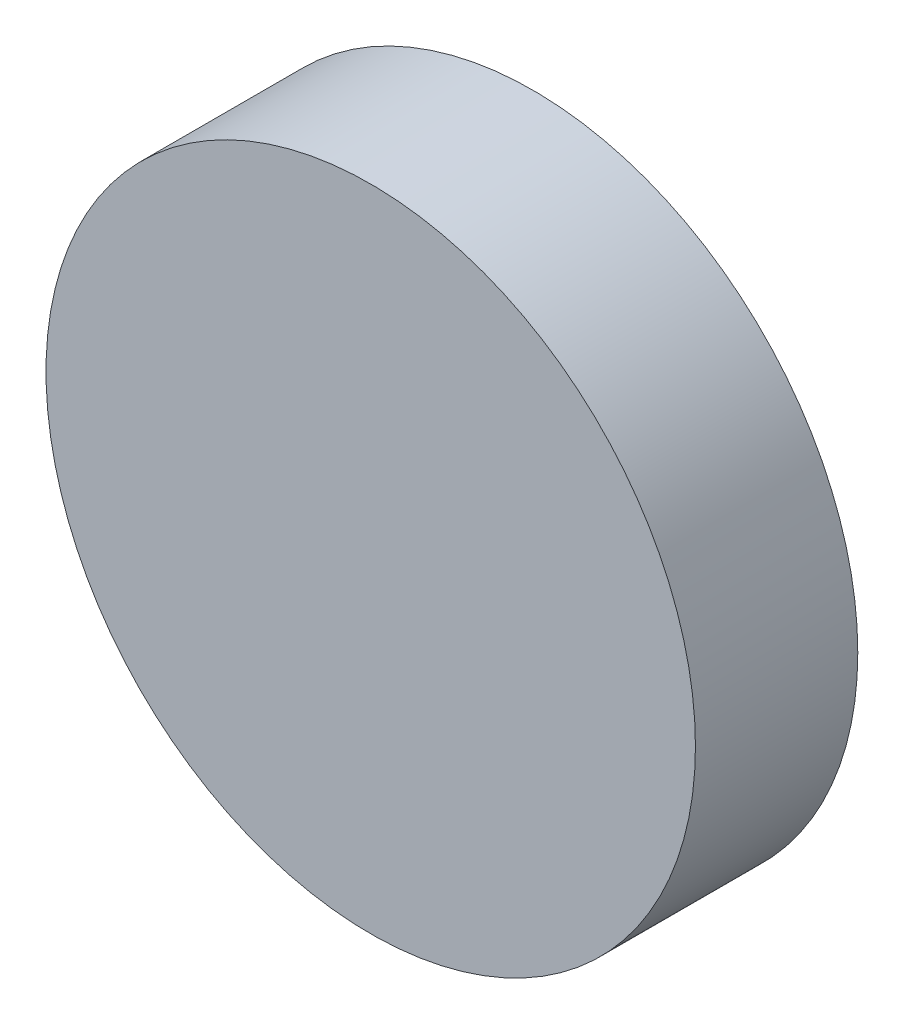
ISO-10303-21;
HEADER;
FILE_DESCRIPTION(('STEP AP214'),'2;1');
FILE_NAME('part.step','',(''),(''),'','','');
FILE_SCHEMA(('AUTOMOTIVE_DESIGN { 1 0 10303 214 1 1 1 1 }'));
ENDSEC;
DATA;
#1=APPLICATION_CONTEXT('core data for automotive mechanical design processes');
#2=APPLICATION_PROTOCOL_DEFINITION('international standard','automotive_design',2000,#1);
#3=PRODUCT_CONTEXT('',#1,'mechanical');
#4=PRODUCT('Part','Part','',(#3));
#5=PRODUCT_RELATED_PRODUCT_CATEGORY('part','',(#4));
#6=PRODUCT_DEFINITION_FORMATION('','',#4);
#7=PRODUCT_DEFINITION_CONTEXT('part definition',#1,'design');
#8=PRODUCT_DEFINITION('design','',#6,#7);
#9=PRODUCT_DEFINITION_SHAPE('','',#8);
#10=(LENGTH_UNIT() NAMED_UNIT(*) SI_UNIT(.MILLI.,.METRE.));
#11=(NAMED_UNIT(*) PLANE_ANGLE_UNIT() SI_UNIT($,.RADIAN.));
#12=(NAMED_UNIT(*) SI_UNIT($,.STERADIAN.) SOLID_ANGLE_UNIT());
#13=UNCERTAINTY_MEASURE_WITH_UNIT(LENGTH_MEASURE(1.E-05),#10,'distance_accuracy_value','');
#14=(GEOMETRIC_REPRESENTATION_CONTEXT(3) GLOBAL_UNCERTAINTY_ASSIGNED_CONTEXT((#13)) GLOBAL_UNIT_ASSIGNED_CONTEXT((#10,
#11,#12)) REPRESENTATION_CONTEXT('',''));
#15=CARTESIAN_POINT('',(0.,0.,0.));
#16=DIRECTION('',(0.,0.,1.));
#17=DIRECTION('',(1.,0.,0.));
#18=AXIS2_PLACEMENT_3D('',#15,#16,#17);
#19=CARTESIAN_POINT('',(0.,0.,12.7));
#20=DIRECTION('',(0.,0.,-1.));
#21=DIRECTION('',(-1.,0.,0.));
#22=AXIS2_PLACEMENT_3D('',#19,#20,#21);
#23=CYLINDRICAL_SURFACE('',#22,25.4);
#24=CARTESIAN_POINT('',(0.,0.,12.7));
#25=DIRECTION('',(0.,0.,1.));
#26=DIRECTION('',(1.,0.,0.));
#27=AXIS2_PLACEMENT_3D('',#24,#25,#26);
#28=CIRCLE('',#27,25.4);
#29=CARTESIAN_POINT('',(25.4,0.,12.7));
#30=VERTEX_POINT('',#29);
#31=EDGE_CURVE('E10',#30,#30,#28,.T.);
#32=ORIENTED_EDGE('',*,*,#31,.F.);
#33=EDGE_LOOP('',(#32));
#34=FACE_BOUND('',#33,.T.);
#35=CARTESIAN_POINT('',(0.,0.,0.));
#36=DIRECTION('',(0.,0.,1.));
#37=DIRECTION('',(1.,0.,0.));
#38=AXIS2_PLACEMENT_3D('',#35,#36,#37);
#39=CIRCLE('',#38,25.4);
#40=CARTESIAN_POINT('',(25.4,0.,0.));
#41=VERTEX_POINT('',#40);
#42=EDGE_CURVE('E40',#41,#41,#39,.T.);
#43=ORIENTED_EDGE('',*,*,#42,.T.);
#44=EDGE_LOOP('',(#43));
#45=FACE_BOUND('',#44,.T.);
#46=ADVANCED_FACE('F37',(#34,#45),#23,.T.);
#47=CARTESIAN_POINT('',(0.,0.,12.7));
#48=DIRECTION('',(0.,0.,1.));
#49=DIRECTION('',(1.,0.,0.));
#50=AXIS2_PLACEMENT_3D('',#47,#48,#49);
#51=PLANE('',#50);
#52=ORIENTED_EDGE('',*,*,#31,.T.);
#53=EDGE_LOOP('',(#52));
#54=FACE_BOUND('',#53,.T.);
#55=ADVANCED_FACE('F54',(#54),#51,.T.);
#56=CARTESIAN_POINT('',(0.,0.,0.));
#57=DIRECTION('',(0.,0.,1.));
#58=DIRECTION('',(1.,0.,0.));
#59=AXIS2_PLACEMENT_3D('',#56,#57,#58);
#60=PLANE('',#59);
#61=ORIENTED_EDGE('',*,*,#42,.F.);
#62=EDGE_LOOP('',(#61));
#63=FACE_BOUND('',#62,.T.);
#64=ADVANCED_FACE('F52',(#63),#60,.F.);
#65=CLOSED_SHELL('',(#46,#55,#64));
#66=MANIFOLD_SOLID_BREP('B2',#65);
#67=ADVANCED_BREP_SHAPE_REPRESENTATION('',(#18,#66),#14);
#68=SHAPE_DEFINITION_REPRESENTATION(#9,#67);
ENDSEC;
END-ISO-10303-21;
